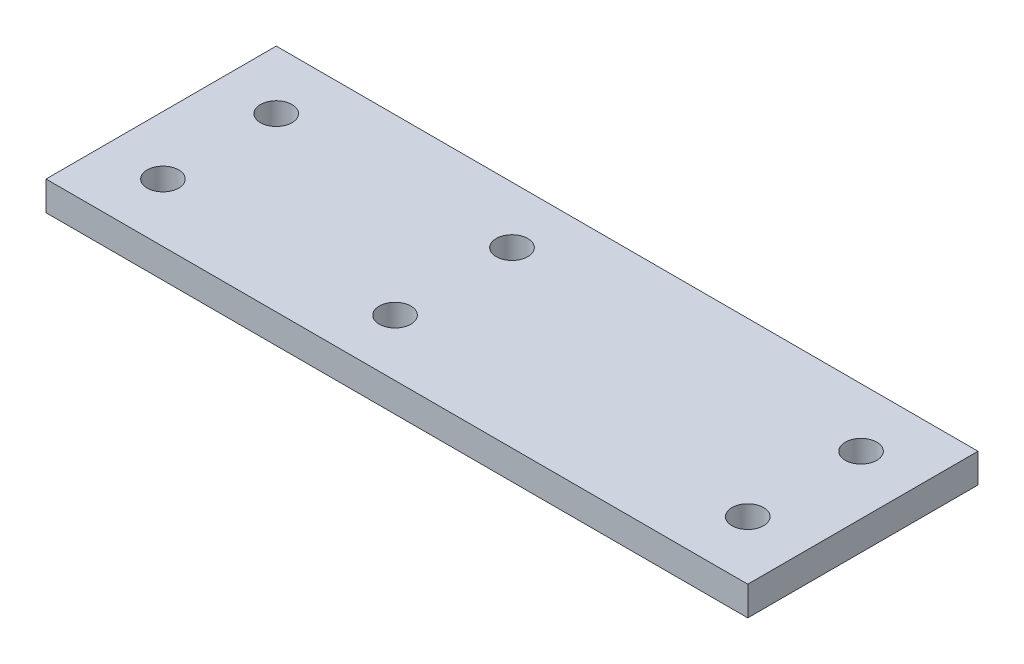
ISO-10303-21;
HEADER;
FILE_DESCRIPTION(('STEP AP214'),'2;1');
FILE_NAME('part.step','',(''),(''),'','','');
FILE_SCHEMA(('AUTOMOTIVE_DESIGN { 1 0 10303 214 1 1 1 1 }'));
ENDSEC;
DATA;
#1=APPLICATION_CONTEXT('core data for automotive mechanical design processes');
#2=APPLICATION_PROTOCOL_DEFINITION('international standard','automotive_design',2000,#1);
#3=PRODUCT_CONTEXT('',#1,'mechanical');
#4=PRODUCT('Part','Part','',(#3));
#5=PRODUCT_RELATED_PRODUCT_CATEGORY('part','',(#4));
#6=PRODUCT_DEFINITION_FORMATION('','',#4);
#7=PRODUCT_DEFINITION_CONTEXT('part definition',#1,'design');
#8=PRODUCT_DEFINITION('design','',#6,#7);
#9=PRODUCT_DEFINITION_SHAPE('','',#8);
#10=(LENGTH_UNIT() NAMED_UNIT(*) SI_UNIT(.MILLI.,.METRE.));
#11=(NAMED_UNIT(*) PLANE_ANGLE_UNIT() SI_UNIT($,.RADIAN.));
#12=(NAMED_UNIT(*) SI_UNIT($,.STERADIAN.) SOLID_ANGLE_UNIT());
#13=UNCERTAINTY_MEASURE_WITH_UNIT(LENGTH_MEASURE(1.E-05),#10,'distance_accuracy_value','');
#14=(GEOMETRIC_REPRESENTATION_CONTEXT(3) GLOBAL_UNCERTAINTY_ASSIGNED_CONTEXT((#13)) GLOBAL_UNIT_ASSIGNED_CONTEXT((#10,
#11,#12)) REPRESENTATION_CONTEXT('',''));
#15=CARTESIAN_POINT('',(0.,0.,0.));
#16=DIRECTION('',(0.,0.,1.));
#17=DIRECTION('',(1.,0.,0.));
#18=AXIS2_PLACEMENT_3D('',#15,#16,#17);
#19=CARTESIAN_POINT('',(76.2,6.35,-25.));
#20=DIRECTION('',(-1.,0.,0.));
#21=DIRECTION('',(0.,0.,1.));
#22=AXIS2_PLACEMENT_3D('',#19,#20,#21);
#23=PLANE('',#22);
#24=DIRECTION('',(0.,0.,-1.));
#25=VECTOR('',#24,1.);
#26=CARTESIAN_POINT('',(76.2,0.,-25.));
#27=LINE('',#26,#25);
#28=CARTESIAN_POINT('',(76.2,0.,25.));
#29=VERTEX_POINT('',#28);
#30=CARTESIAN_POINT('',(76.2,0.,-25.));
#31=VERTEX_POINT('',#30);
#32=EDGE_CURVE('E95',#29,#31,#27,.T.);
#33=ORIENTED_EDGE('',*,*,#32,.T.);
#34=DIRECTION('',(0.,-1.,0.));
#35=VECTOR('',#34,1.);
#36=CARTESIAN_POINT('',(76.2,6.35,-25.));
#37=LINE('',#36,#35);
#38=CARTESIAN_POINT('',(76.2,6.35,-25.));
#39=VERTEX_POINT('',#38);
#40=EDGE_CURVE('E11',#39,#31,#37,.T.);
#41=ORIENTED_EDGE('',*,*,#40,.F.);
#42=DIRECTION('',(0.,0.,-1.));
#43=VECTOR('',#42,1.);
#44=CARTESIAN_POINT('',(76.2,6.35,-25.));
#45=LINE('',#44,#43);
#46=CARTESIAN_POINT('',(76.2,6.35,25.));
#47=VERTEX_POINT('',#46);
#48=EDGE_CURVE('E83',#47,#39,#45,.T.);
#49=ORIENTED_EDGE('',*,*,#48,.F.);
#50=DIRECTION('',(0.,-1.,0.));
#51=VECTOR('',#50,1.);
#52=CARTESIAN_POINT('',(76.2,6.35,25.));
#53=LINE('',#52,#51);
#54=EDGE_CURVE('E91',#47,#29,#53,.T.);
#55=ORIENTED_EDGE('',*,*,#54,.T.);
#56=EDGE_LOOP('',(#33,#41,#49,#55));
#57=FACE_BOUND('',#56,.T.);
#58=ADVANCED_FACE('F32',(#57),#23,.F.);
#59=CARTESIAN_POINT('',(-76.2,6.35,-25.));
#60=DIRECTION('',(0.,0.,1.));
#61=DIRECTION('',(1.,0.,0.));
#62=AXIS2_PLACEMENT_3D('',#59,#60,#61);
#63=PLANE('',#62);
#64=DIRECTION('',(-1.,0.,0.));
#65=VECTOR('',#64,1.);
#66=CARTESIAN_POINT('',(-76.2,0.,-25.));
#67=LINE('',#66,#65);
#68=CARTESIAN_POINT('',(-76.2,0.,-25.));
#69=VERTEX_POINT('',#68);
#70=EDGE_CURVE('E87',#31,#69,#67,.T.);
#71=ORIENTED_EDGE('',*,*,#70,.T.);
#72=DIRECTION('',(0.,-1.,0.));
#73=VECTOR('',#72,1.);
#74=CARTESIAN_POINT('',(-76.2,6.35,-25.));
#75=LINE('',#74,#73);
#76=CARTESIAN_POINT('',(-76.2,6.35,-25.));
#77=VERTEX_POINT('',#76);
#78=EDGE_CURVE('E40',#77,#69,#75,.T.);
#79=ORIENTED_EDGE('',*,*,#78,.F.);
#80=DIRECTION('',(-1.,0.,0.));
#81=VECTOR('',#80,1.);
#82=CARTESIAN_POINT('',(-76.2,6.35,-25.));
#83=LINE('',#82,#81);
#84=EDGE_CURVE('E78',#39,#77,#83,.T.);
#85=ORIENTED_EDGE('',*,*,#84,.F.);
#86=ORIENTED_EDGE('',*,*,#40,.T.);
#87=EDGE_LOOP('',(#71,#79,#85,#86));
#88=FACE_BOUND('',#87,.T.);
#89=ADVANCED_FACE('F86',(#88),#63,.F.);
#90=CARTESIAN_POINT('',(-76.2,6.35,-25.));
#91=DIRECTION('',(1.,0.,0.));
#92=DIRECTION('',(0.,0.,-1.));
#93=AXIS2_PLACEMENT_3D('',#90,#91,#92);
#94=PLANE('',#93);
#95=DIRECTION('',(0.,0.,1.));
#96=VECTOR('',#95,1.);
#97=CARTESIAN_POINT('',(-76.2,0.,-25.));
#98=LINE('',#97,#96);
#99=CARTESIAN_POINT('',(-76.2,0.,25.));
#100=VERTEX_POINT('',#99);
#101=EDGE_CURVE('E65',#69,#100,#98,.T.);
#102=ORIENTED_EDGE('',*,*,#101,.T.);
#103=DIRECTION('',(0.,-1.,0.));
#104=VECTOR('',#103,1.);
#105=CARTESIAN_POINT('',(-76.2,6.35,25.));
#106=LINE('',#105,#104);
#107=CARTESIAN_POINT('',(-76.2,6.35,25.));
#108=VERTEX_POINT('',#107);
#109=EDGE_CURVE('E88',#108,#100,#106,.T.);
#110=ORIENTED_EDGE('',*,*,#109,.F.);
#111=DIRECTION('',(0.,0.,1.));
#112=VECTOR('',#111,1.);
#113=CARTESIAN_POINT('',(-76.2,6.35,-25.));
#114=LINE('',#113,#112);
#115=EDGE_CURVE('E81',#77,#108,#114,.T.);
#116=ORIENTED_EDGE('',*,*,#115,.F.);
#117=ORIENTED_EDGE('',*,*,#78,.T.);
#118=EDGE_LOOP('',(#102,#110,#116,#117));
#119=FACE_BOUND('',#118,.T.);
#120=ADVANCED_FACE('F89',(#119),#94,.F.);
#121=CARTESIAN_POINT('',(-76.2,6.35,25.));
#122=DIRECTION('',(0.,0.,-1.));
#123=DIRECTION('',(-1.,0.,0.));
#124=AXIS2_PLACEMENT_3D('',#121,#122,#123);
#125=PLANE('',#124);
#126=DIRECTION('',(1.,0.,0.));
#127=VECTOR('',#126,1.);
#128=CARTESIAN_POINT('',(-76.2,0.,25.));
#129=LINE('',#128,#127);
#130=EDGE_CURVE('E71',#100,#29,#129,.T.);
#131=ORIENTED_EDGE('',*,*,#130,.T.);
#132=ORIENTED_EDGE('',*,*,#54,.F.);
#133=DIRECTION('',(1.,0.,0.));
#134=VECTOR('',#133,1.);
#135=CARTESIAN_POINT('',(-76.2,6.35,25.));
#136=LINE('',#135,#134);
#137=EDGE_CURVE('E48',#108,#47,#136,.T.);
#138=ORIENTED_EDGE('',*,*,#137,.F.);
#139=ORIENTED_EDGE('',*,*,#109,.T.);
#140=EDGE_LOOP('',(#131,#132,#138,#139));
#141=FACE_BOUND('',#140,.T.);
#142=ADVANCED_FACE('F103',(#141),#125,.F.);
#143=CARTESIAN_POINT('',(0.,6.35,0.));
#144=DIRECTION('',(0.,1.,0.));
#145=DIRECTION('',(0.,0.,1.));
#146=AXIS2_PLACEMENT_3D('',#143,#144,#145);
#147=PLANE('',#146);
#148=CARTESIAN_POINT('',(-12.6989501529304,6.35,-12.6999944889918));
#149=DIRECTION('',(0.,1.,0.));
#150=DIRECTION('',(0.,0.,1.));
#151=AXIS2_PLACEMENT_3D('',#148,#149,#150);
#152=CIRCLE('',#151,3.429);
#153=CARTESIAN_POINT('',(-12.6989501529304,6.35,-9.27099448899176));
#154=VERTEX_POINT('',#153);
#155=EDGE_CURVE('E139',#154,#154,#152,.F.);
#156=ORIENTED_EDGE('',*,*,#155,.T.);
#157=EDGE_LOOP('',(#156));
#158=FACE_BOUND('',#157,.T.);
#159=CARTESIAN_POINT('',(-12.6989501529304,6.35,12.6999944889918));
#160=DIRECTION('',(0.,1.,0.));
#161=DIRECTION('',(0.,0.,1.));
#162=AXIS2_PLACEMENT_3D('',#159,#160,#161);
#163=CIRCLE('',#162,3.429);
#164=CARTESIAN_POINT('',(-12.6989501529304,6.35,16.1289944889918));
#165=VERTEX_POINT('',#164);
#166=EDGE_CURVE('E133',#165,#165,#163,.F.);
#167=ORIENTED_EDGE('',*,*,#166,.T.);
#168=EDGE_LOOP('',(#167));
#169=FACE_BOUND('',#168,.T.);
#170=CARTESIAN_POINT('',(63.5,6.35,-12.3));
#171=DIRECTION('',(0.,1.,0.));
#172=DIRECTION('',(0.,0.,1.));
#173=AXIS2_PLACEMENT_3D('',#170,#171,#172);
#174=CIRCLE('',#173,3.429);
#175=CARTESIAN_POINT('',(63.5,6.35,-8.87099999999998));
#176=VERTEX_POINT('',#175);
#177=EDGE_CURVE('E127',#176,#176,#174,.F.);
#178=ORIENTED_EDGE('',*,*,#177,.T.);
#179=EDGE_LOOP('',(#178));
#180=FACE_BOUND('',#179,.T.);
#181=CARTESIAN_POINT('',(63.5,6.35,12.3));
#182=DIRECTION('',(0.,1.,0.));
#183=DIRECTION('',(0.,0.,1.));
#184=AXIS2_PLACEMENT_3D('',#181,#182,#183);
#185=CIRCLE('',#184,3.42899999999998);
#186=CARTESIAN_POINT('',(63.5,6.35,15.729));
#187=VERTEX_POINT('',#186);
#188=EDGE_CURVE('E121',#187,#187,#185,.F.);
#189=ORIENTED_EDGE('',*,*,#188,.T.);
#190=EDGE_LOOP('',(#189));
#191=FACE_BOUND('',#190,.T.);
#192=CARTESIAN_POINT('',(-63.5,6.35,-12.3));
#193=DIRECTION('',(0.,1.,0.));
#194=DIRECTION('',(0.,0.,1.));
#195=AXIS2_PLACEMENT_3D('',#192,#193,#194);
#196=CIRCLE('',#195,3.429);
#197=CARTESIAN_POINT('',(-63.5,6.35,-8.871));
#198=VERTEX_POINT('',#197);
#199=EDGE_CURVE('E115',#198,#198,#196,.F.);
#200=ORIENTED_EDGE('',*,*,#199,.T.);
#201=EDGE_LOOP('',(#200));
#202=FACE_BOUND('',#201,.T.);
#203=CARTESIAN_POINT('',(-63.5,6.35,12.3));
#204=DIRECTION('',(0.,1.,0.));
#205=DIRECTION('',(0.,0.,1.));
#206=AXIS2_PLACEMENT_3D('',#203,#204,#205);
#207=CIRCLE('',#206,3.429);
#208=CARTESIAN_POINT('',(-63.5,6.35,15.729));
#209=VERTEX_POINT('',#208);
#210=EDGE_CURVE('E109',#209,#209,#207,.F.);
#211=ORIENTED_EDGE('',*,*,#210,.T.);
#212=EDGE_LOOP('',(#211));
#213=FACE_BOUND('',#212,.T.);
#214=ORIENTED_EDGE('',*,*,#48,.T.);
#215=ORIENTED_EDGE('',*,*,#84,.T.);
#216=ORIENTED_EDGE('',*,*,#115,.T.);
#217=ORIENTED_EDGE('',*,*,#137,.T.);
#218=EDGE_LOOP('',(#214,#215,#216,#217));
#219=FACE_BOUND('',#218,.T.);
#220=ADVANCED_FACE('F79',(#158,#169,#180,#191,#202,#213,#219),#147,.T.);
#221=CARTESIAN_POINT('',(0.,0.,0.));
#222=DIRECTION('',(0.,1.,0.));
#223=DIRECTION('',(0.,0.,1.));
#224=AXIS2_PLACEMENT_3D('',#221,#222,#223);
#225=PLANE('',#224);
#226=CARTESIAN_POINT('',(-12.6989501529304,0.,-12.6999944889918));
#227=DIRECTION('',(0.,-1.,0.));
#228=DIRECTION('',(0.,0.,-1.));
#229=AXIS2_PLACEMENT_3D('',#226,#227,#228);
#230=CIRCLE('',#229,3.429);
#231=CARTESIAN_POINT('',(-12.6989501529304,0.,-16.1289944889918));
#232=VERTEX_POINT('',#231);
#233=EDGE_CURVE('E136',#232,#232,#230,.T.);
#234=ORIENTED_EDGE('',*,*,#233,.F.);
#235=EDGE_LOOP('',(#234));
#236=FACE_BOUND('',#235,.T.);
#237=CARTESIAN_POINT('',(-12.6989501529304,0.,12.6999944889918));
#238=DIRECTION('',(0.,-1.,0.));
#239=DIRECTION('',(0.,0.,-1.));
#240=AXIS2_PLACEMENT_3D('',#237,#238,#239);
#241=CIRCLE('',#240,3.429);
#242=CARTESIAN_POINT('',(-12.6989501529304,0.,9.27099448899177));
#243=VERTEX_POINT('',#242);
#244=EDGE_CURVE('E130',#243,#243,#241,.T.);
#245=ORIENTED_EDGE('',*,*,#244,.F.);
#246=EDGE_LOOP('',(#245));
#247=FACE_BOUND('',#246,.T.);
#248=CARTESIAN_POINT('',(63.5,0.,-12.3));
#249=DIRECTION('',(0.,-1.,0.));
#250=DIRECTION('',(0.,0.,-1.));
#251=AXIS2_PLACEMENT_3D('',#248,#249,#250);
#252=CIRCLE('',#251,3.429);
#253=CARTESIAN_POINT('',(63.5,0.,-15.729));
#254=VERTEX_POINT('',#253);
#255=EDGE_CURVE('E124',#254,#254,#252,.T.);
#256=ORIENTED_EDGE('',*,*,#255,.F.);
#257=EDGE_LOOP('',(#256));
#258=FACE_BOUND('',#257,.T.);
#259=CARTESIAN_POINT('',(63.5,0.,12.3));
#260=DIRECTION('',(0.,-1.,0.));
#261=DIRECTION('',(0.,0.,1.));
#262=AXIS2_PLACEMENT_3D('',#259,#260,#261);
#263=CIRCLE('',#262,3.42899999999998);
#264=CARTESIAN_POINT('',(63.5,0.,15.729));
#265=VERTEX_POINT('',#264);
#266=EDGE_CURVE('E118',#265,#265,#263,.T.);
#267=ORIENTED_EDGE('',*,*,#266,.F.);
#268=EDGE_LOOP('',(#267));
#269=FACE_BOUND('',#268,.T.);
#270=CARTESIAN_POINT('',(-63.5,0.,-12.3));
#271=DIRECTION('',(0.,-1.,0.));
#272=DIRECTION('',(0.,0.,1.));
#273=AXIS2_PLACEMENT_3D('',#270,#271,#272);
#274=CIRCLE('',#273,3.429);
#275=CARTESIAN_POINT('',(-63.5,0.,-8.871));
#276=VERTEX_POINT('',#275);
#277=EDGE_CURVE('E112',#276,#276,#274,.T.);
#278=ORIENTED_EDGE('',*,*,#277,.F.);
#279=EDGE_LOOP('',(#278));
#280=FACE_BOUND('',#279,.T.);
#281=CARTESIAN_POINT('',(-63.5,0.,12.3));
#282=DIRECTION('',(0.,-1.,0.));
#283=DIRECTION('',(0.,0.,-1.));
#284=AXIS2_PLACEMENT_3D('',#281,#282,#283);
#285=CIRCLE('',#284,3.429);
#286=CARTESIAN_POINT('',(-63.5,0.,8.87100000000001));
#287=VERTEX_POINT('',#286);
#288=EDGE_CURVE('E98',#287,#287,#285,.T.);
#289=ORIENTED_EDGE('',*,*,#288,.F.);
#290=EDGE_LOOP('',(#289));
#291=FACE_BOUND('',#290,.T.);
#292=ORIENTED_EDGE('',*,*,#32,.F.);
#293=ORIENTED_EDGE('',*,*,#130,.F.);
#294=ORIENTED_EDGE('',*,*,#101,.F.);
#295=ORIENTED_EDGE('',*,*,#70,.F.);
#296=EDGE_LOOP('',(#292,#293,#294,#295));
#297=FACE_BOUND('',#296,.T.);
#298=ADVANCED_FACE('F106',(#236,#247,#258,#269,#280,#291,#297),#225,.F.);
#299=CARTESIAN_POINT('',(-63.5,6.351,12.3));
#300=DIRECTION('',(0.,-1.,0.));
#301=DIRECTION('',(0.,0.,-1.));
#302=AXIS2_PLACEMENT_3D('',#299,#300,#301);
#303=CYLINDRICAL_SURFACE('',#302,3.429);
#304=ORIENTED_EDGE('',*,*,#210,.F.);
#305=EDGE_LOOP('',(#304));
#306=FACE_BOUND('',#305,.T.);
#307=ORIENTED_EDGE('',*,*,#288,.T.);
#308=EDGE_LOOP('',(#307));
#309=FACE_BOUND('',#308,.T.);
#310=ADVANCED_FACE('F149',(#306,#309),#303,.F.);
#311=CARTESIAN_POINT('',(-63.5,6.351,-12.3));
#312=DIRECTION('',(0.,-1.,0.));
#313=DIRECTION('',(0.,0.,-1.));
#314=AXIS2_PLACEMENT_3D('',#311,#312,#313);
#315=CYLINDRICAL_SURFACE('',#314,3.429);
#316=ORIENTED_EDGE('',*,*,#199,.F.);
#317=EDGE_LOOP('',(#316));
#318=FACE_BOUND('',#317,.T.);
#319=ORIENTED_EDGE('',*,*,#277,.T.);
#320=EDGE_LOOP('',(#319));
#321=FACE_BOUND('',#320,.T.);
#322=ADVANCED_FACE('F162',(#318,#321),#315,.F.);
#323=CARTESIAN_POINT('',(63.5,6.351,12.3));
#324=DIRECTION('',(0.,-1.,0.));
#325=DIRECTION('',(0.,0.,-1.));
#326=AXIS2_PLACEMENT_3D('',#323,#324,#325);
#327=CYLINDRICAL_SURFACE('',#326,3.42899999999998);
#328=ORIENTED_EDGE('',*,*,#188,.F.);
#329=EDGE_LOOP('',(#328));
#330=FACE_BOUND('',#329,.T.);
#331=ORIENTED_EDGE('',*,*,#266,.T.);
#332=EDGE_LOOP('',(#331));
#333=FACE_BOUND('',#332,.T.);
#334=ADVANCED_FACE('F168',(#330,#333),#327,.F.);
#335=CARTESIAN_POINT('',(63.5,6.351,-12.3));
#336=DIRECTION('',(0.,-1.,0.));
#337=DIRECTION('',(0.,0.,-1.));
#338=AXIS2_PLACEMENT_3D('',#335,#336,#337);
#339=CYLINDRICAL_SURFACE('',#338,3.429);
#340=ORIENTED_EDGE('',*,*,#177,.F.);
#341=EDGE_LOOP('',(#340));
#342=FACE_BOUND('',#341,.T.);
#343=ORIENTED_EDGE('',*,*,#255,.T.);
#344=EDGE_LOOP('',(#343));
#345=FACE_BOUND('',#344,.T.);
#346=ADVANCED_FACE('F201',(#342,#345),#339,.F.);
#347=CARTESIAN_POINT('',(-12.6989501529304,6.351,12.6999944889918));
#348=DIRECTION('',(0.,-1.,0.));
#349=DIRECTION('',(0.,0.,-1.));
#350=AXIS2_PLACEMENT_3D('',#347,#348,#349);
#351=CYLINDRICAL_SURFACE('',#350,3.429);
#352=ORIENTED_EDGE('',*,*,#166,.F.);
#353=EDGE_LOOP('',(#352));
#354=FACE_BOUND('',#353,.T.);
#355=ORIENTED_EDGE('',*,*,#244,.T.);
#356=EDGE_LOOP('',(#355));
#357=FACE_BOUND('',#356,.T.);
#358=ADVANCED_FACE('F206',(#354,#357),#351,.F.);
#359=CARTESIAN_POINT('',(-12.6989501529304,6.351,-12.6999944889918));
#360=DIRECTION('',(0.,-1.,0.));
#361=DIRECTION('',(0.,0.,-1.));
#362=AXIS2_PLACEMENT_3D('',#359,#360,#361);
#363=CYLINDRICAL_SURFACE('',#362,3.429);
#364=ORIENTED_EDGE('',*,*,#155,.F.);
#365=EDGE_LOOP('',(#364));
#366=FACE_BOUND('',#365,.T.);
#367=ORIENTED_EDGE('',*,*,#233,.T.);
#368=EDGE_LOOP('',(#367));
#369=FACE_BOUND('',#368,.T.);
#370=ADVANCED_FACE('F145',(#366,#369),#363,.F.);
#371=CLOSED_SHELL('',(#58,#89,#120,#142,#220,#298,#310,#322,#334,#346,#358,#370));
#372=MANIFOLD_SOLID_BREP('B2',#371);
#373=ADVANCED_BREP_SHAPE_REPRESENTATION('',(#18,#372),#14);
#374=SHAPE_DEFINITION_REPRESENTATION(#9,#373);
ENDSEC;
END-ISO-10303-21;
